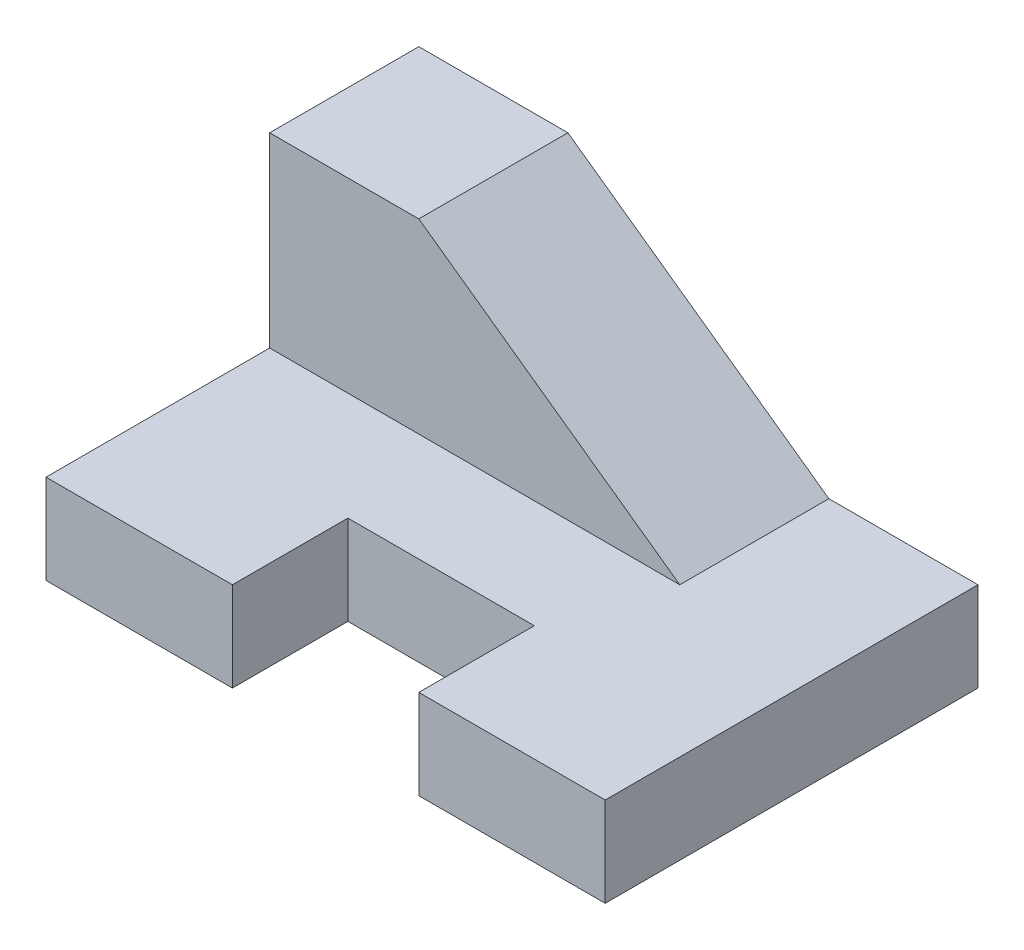
ISO-10303-21;
HEADER;
FILE_DESCRIPTION(('STEP AP214'),'2;1');
FILE_NAME('part.step','',(''),(''),'','','');
FILE_SCHEMA(('AUTOMOTIVE_DESIGN { 1 0 10303 214 1 1 1 1 }'));
ENDSEC;
DATA;
#1=APPLICATION_CONTEXT('core data for automotive mechanical design processes');
#2=APPLICATION_PROTOCOL_DEFINITION('international standard','automotive_design',2000,#1);
#3=PRODUCT_CONTEXT('',#1,'mechanical');
#4=PRODUCT('Part','Part','',(#3));
#5=PRODUCT_RELATED_PRODUCT_CATEGORY('part','',(#4));
#6=PRODUCT_DEFINITION_FORMATION('','',#4);
#7=PRODUCT_DEFINITION_CONTEXT('part definition',#1,'design');
#8=PRODUCT_DEFINITION('design','',#6,#7);
#9=PRODUCT_DEFINITION_SHAPE('','',#8);
#10=(LENGTH_UNIT() NAMED_UNIT(*) SI_UNIT(.MILLI.,.METRE.));
#11=(NAMED_UNIT(*) PLANE_ANGLE_UNIT() SI_UNIT($,.RADIAN.));
#12=(NAMED_UNIT(*) SI_UNIT($,.STERADIAN.) SOLID_ANGLE_UNIT());
#13=UNCERTAINTY_MEASURE_WITH_UNIT(LENGTH_MEASURE(1.E-05),#10,'distance_accuracy_value','');
#14=(GEOMETRIC_REPRESENTATION_CONTEXT(3) GLOBAL_UNCERTAINTY_ASSIGNED_CONTEXT((#13)) GLOBAL_UNIT_ASSIGNED_CONTEXT((#10,
#11,#12)) REPRESENTATION_CONTEXT('',''));
#15=CARTESIAN_POINT('',(0.,0.,0.));
#16=DIRECTION('',(0.,0.,1.));
#17=DIRECTION('',(1.,0.,0.));
#18=AXIS2_PLACEMENT_3D('',#15,#16,#17);
#19=CARTESIAN_POINT('',(0.,12.,0.));
#20=DIRECTION('',(0.,-1.,0.));
#21=DIRECTION('',(0.,0.,-1.));
#22=AXIS2_PLACEMENT_3D('',#19,#20,#21);
#23=PLANE('',#22);
#24=DIRECTION('',(0.,0.,-1.));
#25=VECTOR('',#24,1.);
#26=CARTESIAN_POINT('',(17.5,12.,-5.));
#27=LINE('',#26,#25);
#28=CARTESIAN_POINT('',(17.5,12.,-5.));
#29=VERTEX_POINT('',#28);
#30=CARTESIAN_POINT('',(17.5,12.,-25.));
#31=VERTEX_POINT('',#30);
#32=EDGE_CURVE('E175',#29,#31,#27,.T.);
#33=ORIENTED_EDGE('',*,*,#32,.F.);
#34=DIRECTION('',(-1.,0.,0.));
#35=VECTOR('',#34,1.);
#36=CARTESIAN_POINT('',(17.5,12.,-5.));
#37=LINE('',#36,#35);
#38=CARTESIAN_POINT('',(-37.5,12.,-5.));
#39=VERTEX_POINT('',#38);
#40=EDGE_CURVE('E241',#29,#39,#37,.T.);
#41=ORIENTED_EDGE('',*,*,#40,.T.);
#42=DIRECTION('',(0.,0.,1.));
#43=VECTOR('',#42,1.);
#44=CARTESIAN_POINT('',(-37.5,12.,25.));
#45=LINE('',#44,#43);
#46=CARTESIAN_POINT('',(-37.5,12.,25.));
#47=VERTEX_POINT('',#46);
#48=EDGE_CURVE('E120',#39,#47,#45,.T.);
#49=ORIENTED_EDGE('',*,*,#48,.T.);
#50=DIRECTION('',(1.,0.,0.));
#51=VECTOR('',#50,1.);
#52=CARTESIAN_POINT('',(-12.5,12.,25.));
#53=LINE('',#52,#51);
#54=CARTESIAN_POINT('',(-12.5,12.,25.));
#55=VERTEX_POINT('',#54);
#56=EDGE_CURVE('E222',#47,#55,#53,.T.);
#57=ORIENTED_EDGE('',*,*,#56,.T.);
#58=DIRECTION('',(0.,0.,-1.));
#59=VECTOR('',#58,1.);
#60=CARTESIAN_POINT('',(-12.5,12.,9.51086956521739));
#61=LINE('',#60,#59);
#62=CARTESIAN_POINT('',(-12.5,12.,9.51086956521739));
#63=VERTEX_POINT('',#62);
#64=EDGE_CURVE('E211',#55,#63,#61,.T.);
#65=ORIENTED_EDGE('',*,*,#64,.T.);
#66=DIRECTION('',(1.,0.,0.));
#67=VECTOR('',#66,1.);
#68=CARTESIAN_POINT('',(12.5,12.,9.51086956521739));
#69=LINE('',#68,#67);
#70=CARTESIAN_POINT('',(12.5,12.,9.51086956521739));
#71=VERTEX_POINT('',#70);
#72=EDGE_CURVE('E136',#63,#71,#69,.T.);
#73=ORIENTED_EDGE('',*,*,#72,.T.);
#74=DIRECTION('',(0.,0.,1.));
#75=VECTOR('',#74,1.);
#76=CARTESIAN_POINT('',(12.5,12.,25.));
#77=LINE('',#76,#75);
#78=CARTESIAN_POINT('',(12.5,12.,25.));
#79=VERTEX_POINT('',#78);
#80=EDGE_CURVE('E132',#71,#79,#77,.T.);
#81=ORIENTED_EDGE('',*,*,#80,.T.);
#82=DIRECTION('',(1.,0.,0.));
#83=VECTOR('',#82,1.);
#84=CARTESIAN_POINT('',(37.5,12.,25.));
#85=LINE('',#84,#83);
#86=CARTESIAN_POINT('',(37.5,12.,25.));
#87=VERTEX_POINT('',#86);
#88=EDGE_CURVE('E133',#79,#87,#85,.T.);
#89=ORIENTED_EDGE('',*,*,#88,.T.);
#90=DIRECTION('',(0.,0.,-1.));
#91=VECTOR('',#90,1.);
#92=CARTESIAN_POINT('',(37.5,12.,-25.));
#93=LINE('',#92,#91);
#94=CARTESIAN_POINT('',(37.5,12.,-25.));
#95=VERTEX_POINT('',#94);
#96=EDGE_CURVE('E77',#87,#95,#93,.T.);
#97=ORIENTED_EDGE('',*,*,#96,.T.);
#98=DIRECTION('',(-1.,0.,0.));
#99=VECTOR('',#98,1.);
#100=CARTESIAN_POINT('',(-37.5,12.,-25.));
#101=LINE('',#100,#99);
#102=EDGE_CURVE('E159',#95,#31,#101,.T.);
#103=ORIENTED_EDGE('',*,*,#102,.T.);
#104=EDGE_LOOP('',(#33,#41,#49,#57,#65,#73,#81,#89,#97,#103));
#105=FACE_BOUND('',#104,.T.);
#106=ADVANCED_FACE('F51',(#105),#23,.F.);
#107=CARTESIAN_POINT('',(-37.5,12.,25.));
#108=DIRECTION('',(1.,0.,0.));
#109=DIRECTION('',(0.,0.,-1.));
#110=AXIS2_PLACEMENT_3D('',#107,#108,#109);
#111=PLANE('',#110);
#112=DIRECTION('',(0.,0.,1.));
#113=VECTOR('',#112,1.);
#114=CARTESIAN_POINT('',(-37.5,0.,25.));
#115=LINE('',#114,#113);
#116=CARTESIAN_POINT('',(-37.5,0.,-25.));
#117=VERTEX_POINT('',#116);
#118=CARTESIAN_POINT('',(-37.5,0.,25.));
#119=VERTEX_POINT('',#118);
#120=EDGE_CURVE('E170',#117,#119,#115,.T.);
#121=ORIENTED_EDGE('',*,*,#120,.T.);
#122=DIRECTION('',(0.,-1.,0.));
#123=VECTOR('',#122,1.);
#124=CARTESIAN_POINT('',(-37.5,12.,25.));
#125=LINE('',#124,#123);
#126=EDGE_CURVE('E11',#47,#119,#125,.T.);
#127=ORIENTED_EDGE('',*,*,#126,.F.);
#128=ORIENTED_EDGE('',*,*,#48,.F.);
#129=DIRECTION('',(0.,1.,0.));
#130=VECTOR('',#129,1.);
#131=CARTESIAN_POINT('',(-37.5,12.,-5.));
#132=LINE('',#131,#130);
#133=CARTESIAN_POINT('',(-37.5,37.,-5.));
#134=VERTEX_POINT('',#133);
#135=EDGE_CURVE('E70',#39,#134,#132,.T.);
#136=ORIENTED_EDGE('',*,*,#135,.T.);
#137=DIRECTION('',(0.,0.,-1.));
#138=VECTOR('',#137,1.);
#139=CARTESIAN_POINT('',(-37.5,37.,-5.));
#140=LINE('',#139,#138);
#141=CARTESIAN_POINT('',(-37.5,37.,-25.));
#142=VERTEX_POINT('',#141);
#143=EDGE_CURVE('E229',#134,#142,#140,.T.);
#144=ORIENTED_EDGE('',*,*,#143,.T.);
#145=DIRECTION('',(0.,-1.,0.));
#146=VECTOR('',#145,1.);
#147=CARTESIAN_POINT('',(-37.5,12.,-25.));
#148=LINE('',#147,#146);
#149=EDGE_CURVE('E167',#142,#117,#148,.T.);
#150=ORIENTED_EDGE('',*,*,#149,.T.);
#151=EDGE_LOOP('',(#121,#127,#128,#136,#144,#150));
#152=FACE_BOUND('',#151,.T.);
#153=ADVANCED_FACE('F52',(#152),#111,.F.);
#154=CARTESIAN_POINT('',(-12.5,12.,25.));
#155=DIRECTION('',(0.,0.,-1.));
#156=DIRECTION('',(-1.,0.,0.));
#157=AXIS2_PLACEMENT_3D('',#154,#155,#156);
#158=PLANE('',#157);
#159=DIRECTION('',(1.,0.,0.));
#160=VECTOR('',#159,1.);
#161=CARTESIAN_POINT('',(-12.5,0.,25.));
#162=LINE('',#161,#160);
#163=CARTESIAN_POINT('',(-12.5,0.,25.));
#164=VERTEX_POINT('',#163);
#165=EDGE_CURVE('E172',#119,#164,#162,.T.);
#166=ORIENTED_EDGE('',*,*,#165,.T.);
#167=DIRECTION('',(0.,-1.,0.));
#168=VECTOR('',#167,1.);
#169=CARTESIAN_POINT('',(-12.5,12.,25.));
#170=LINE('',#169,#168);
#171=EDGE_CURVE('E58',#55,#164,#170,.T.);
#172=ORIENTED_EDGE('',*,*,#171,.F.);
#173=ORIENTED_EDGE('',*,*,#56,.F.);
#174=ORIENTED_EDGE('',*,*,#126,.T.);
#175=EDGE_LOOP('',(#166,#172,#173,#174));
#176=FACE_BOUND('',#175,.T.);
#177=ADVANCED_FACE('F263',(#176),#158,.F.);
#178=CARTESIAN_POINT('',(-12.5,12.,9.51086956521739));
#179=DIRECTION('',(-1.,0.,0.));
#180=DIRECTION('',(0.,0.,1.));
#181=AXIS2_PLACEMENT_3D('',#178,#179,#180);
#182=PLANE('',#181);
#183=DIRECTION('',(0.,0.,-1.));
#184=VECTOR('',#183,1.);
#185=CARTESIAN_POINT('',(-12.5,0.,9.51086956521739));
#186=LINE('',#185,#184);
#187=CARTESIAN_POINT('',(-12.5,0.,9.51086956521739));
#188=VERTEX_POINT('',#187);
#189=EDGE_CURVE('E173',#164,#188,#186,.T.);
#190=ORIENTED_EDGE('',*,*,#189,.T.);
#191=DIRECTION('',(0.,-1.,0.));
#192=VECTOR('',#191,1.);
#193=CARTESIAN_POINT('',(-12.5,12.,9.51086956521739));
#194=LINE('',#193,#192);
#195=EDGE_CURVE('E199',#63,#188,#194,.T.);
#196=ORIENTED_EDGE('',*,*,#195,.F.);
#197=ORIENTED_EDGE('',*,*,#64,.F.);
#198=ORIENTED_EDGE('',*,*,#171,.T.);
#199=EDGE_LOOP('',(#190,#196,#197,#198));
#200=FACE_BOUND('',#199,.T.);
#201=ADVANCED_FACE('F207',(#200),#182,.F.);
#202=CARTESIAN_POINT('',(12.5,12.,9.51086956521739));
#203=DIRECTION('',(0.,0.,-1.));
#204=DIRECTION('',(-1.,0.,0.));
#205=AXIS2_PLACEMENT_3D('',#202,#203,#204);
#206=PLANE('',#205);
#207=DIRECTION('',(1.,0.,0.));
#208=VECTOR('',#207,1.);
#209=CARTESIAN_POINT('',(12.5,0.,9.51086956521739));
#210=LINE('',#209,#208);
#211=CARTESIAN_POINT('',(12.5,0.,9.51086956521739));
#212=VERTEX_POINT('',#211);
#213=EDGE_CURVE('E176',#188,#212,#210,.T.);
#214=ORIENTED_EDGE('',*,*,#213,.T.);
#215=DIRECTION('',(0.,-1.,0.));
#216=VECTOR('',#215,1.);
#217=CARTESIAN_POINT('',(12.5,12.,9.51086956521739));
#218=LINE('',#217,#216);
#219=EDGE_CURVE('E155',#71,#212,#218,.T.);
#220=ORIENTED_EDGE('',*,*,#219,.F.);
#221=ORIENTED_EDGE('',*,*,#72,.F.);
#222=ORIENTED_EDGE('',*,*,#195,.T.);
#223=EDGE_LOOP('',(#214,#220,#221,#222));
#224=FACE_BOUND('',#223,.T.);
#225=ADVANCED_FACE('F217',(#224),#206,.F.);
#226=CARTESIAN_POINT('',(12.5,12.,25.));
#227=DIRECTION('',(1.,0.,0.));
#228=DIRECTION('',(0.,0.,-1.));
#229=AXIS2_PLACEMENT_3D('',#226,#227,#228);
#230=PLANE('',#229);
#231=DIRECTION('',(0.,0.,1.));
#232=VECTOR('',#231,1.);
#233=CARTESIAN_POINT('',(12.5,0.,25.));
#234=LINE('',#233,#232);
#235=CARTESIAN_POINT('',(12.5,0.,25.));
#236=VERTEX_POINT('',#235);
#237=EDGE_CURVE('E146',#212,#236,#234,.T.);
#238=ORIENTED_EDGE('',*,*,#237,.T.);
#239=DIRECTION('',(0.,-1.,0.));
#240=VECTOR('',#239,1.);
#241=CARTESIAN_POINT('',(12.5,12.,25.));
#242=LINE('',#241,#240);
#243=EDGE_CURVE('E144',#79,#236,#242,.T.);
#244=ORIENTED_EDGE('',*,*,#243,.F.);
#245=ORIENTED_EDGE('',*,*,#80,.F.);
#246=ORIENTED_EDGE('',*,*,#219,.T.);
#247=EDGE_LOOP('',(#238,#244,#245,#246));
#248=FACE_BOUND('',#247,.T.);
#249=ADVANCED_FACE('F148',(#248),#230,.F.);
#250=CARTESIAN_POINT('',(37.5,12.,25.));
#251=DIRECTION('',(0.,0.,-1.));
#252=DIRECTION('',(-1.,0.,0.));
#253=AXIS2_PLACEMENT_3D('',#250,#251,#252);
#254=PLANE('',#253);
#255=DIRECTION('',(1.,0.,0.));
#256=VECTOR('',#255,1.);
#257=CARTESIAN_POINT('',(37.5,0.,25.));
#258=LINE('',#257,#256);
#259=CARTESIAN_POINT('',(37.5,0.,25.));
#260=VERTEX_POINT('',#259);
#261=EDGE_CURVE('E181',#236,#260,#258,.T.);
#262=ORIENTED_EDGE('',*,*,#261,.T.);
#263=DIRECTION('',(0.,-1.,0.));
#264=VECTOR('',#263,1.);
#265=CARTESIAN_POINT('',(37.5,12.,25.));
#266=LINE('',#265,#264);
#267=EDGE_CURVE('E153',#87,#260,#266,.T.);
#268=ORIENTED_EDGE('',*,*,#267,.F.);
#269=ORIENTED_EDGE('',*,*,#88,.F.);
#270=ORIENTED_EDGE('',*,*,#243,.T.);
#271=EDGE_LOOP('',(#262,#268,#269,#270));
#272=FACE_BOUND('',#271,.T.);
#273=ADVANCED_FACE('F154',(#272),#254,.F.);
#274=CARTESIAN_POINT('',(37.5,12.,-25.));
#275=DIRECTION('',(-1.,0.,0.));
#276=DIRECTION('',(0.,0.,1.));
#277=AXIS2_PLACEMENT_3D('',#274,#275,#276);
#278=PLANE('',#277);
#279=DIRECTION('',(0.,0.,-1.));
#280=VECTOR('',#279,1.);
#281=CARTESIAN_POINT('',(37.5,0.,-25.));
#282=LINE('',#281,#280);
#283=CARTESIAN_POINT('',(37.5,0.,-25.));
#284=VERTEX_POINT('',#283);
#285=EDGE_CURVE('E187',#260,#284,#282,.T.);
#286=ORIENTED_EDGE('',*,*,#285,.T.);
#287=DIRECTION('',(0.,-1.,0.));
#288=VECTOR('',#287,1.);
#289=CARTESIAN_POINT('',(37.5,12.,-25.));
#290=LINE('',#289,#288);
#291=EDGE_CURVE('E191',#95,#284,#290,.T.);
#292=ORIENTED_EDGE('',*,*,#291,.F.);
#293=ORIENTED_EDGE('',*,*,#96,.F.);
#294=ORIENTED_EDGE('',*,*,#267,.T.);
#295=EDGE_LOOP('',(#286,#292,#293,#294));
#296=FACE_BOUND('',#295,.T.);
#297=ADVANCED_FACE('F281',(#296),#278,.F.);
#298=CARTESIAN_POINT('',(-37.5,12.,-25.));
#299=DIRECTION('',(0.,0.,1.));
#300=DIRECTION('',(1.,0.,0.));
#301=AXIS2_PLACEMENT_3D('',#298,#299,#300);
#302=PLANE('',#301);
#303=DIRECTION('',(-1.,0.,0.));
#304=VECTOR('',#303,1.);
#305=CARTESIAN_POINT('',(-37.5,0.,-25.));
#306=LINE('',#305,#304);
#307=EDGE_CURVE('E109',#284,#117,#306,.T.);
#308=ORIENTED_EDGE('',*,*,#307,.T.);
#309=ORIENTED_EDGE('',*,*,#149,.F.);
#310=DIRECTION('',(1.,0.,0.));
#311=VECTOR('',#310,1.);
#312=CARTESIAN_POINT('',(-37.5,37.,-25.));
#313=LINE('',#312,#311);
#314=CARTESIAN_POINT('',(-17.5,37.,-25.));
#315=VERTEX_POINT('',#314);
#316=EDGE_CURVE('E243',#142,#315,#313,.T.);
#317=ORIENTED_EDGE('',*,*,#316,.T.);
#318=DIRECTION('',(0.813733471206735,-0.581238193719096,0.));
#319=VECTOR('',#318,1.);
#320=CARTESIAN_POINT('',(-17.5,37.,-25.));
#321=LINE('',#320,#319);
#322=EDGE_CURVE('E238',#315,#31,#321,.T.);
#323=ORIENTED_EDGE('',*,*,#322,.T.);
#324=ORIENTED_EDGE('',*,*,#102,.F.);
#325=ORIENTED_EDGE('',*,*,#291,.T.);
#326=EDGE_LOOP('',(#308,#309,#317,#323,#324,#325));
#327=FACE_BOUND('',#326,.T.);
#328=ADVANCED_FACE('F282',(#327),#302,.F.);
#329=CARTESIAN_POINT('',(0.,0.,0.));
#330=DIRECTION('',(0.,-1.,0.));
#331=DIRECTION('',(0.,0.,-1.));
#332=AXIS2_PLACEMENT_3D('',#329,#330,#331);
#333=PLANE('',#332);
#334=ORIENTED_EDGE('',*,*,#120,.F.);
#335=ORIENTED_EDGE('',*,*,#307,.F.);
#336=ORIENTED_EDGE('',*,*,#285,.F.);
#337=ORIENTED_EDGE('',*,*,#261,.F.);
#338=ORIENTED_EDGE('',*,*,#237,.F.);
#339=ORIENTED_EDGE('',*,*,#213,.F.);
#340=ORIENTED_EDGE('',*,*,#189,.F.);
#341=ORIENTED_EDGE('',*,*,#165,.F.);
#342=EDGE_LOOP('',(#334,#335,#336,#337,#338,#339,#340,#341));
#343=FACE_BOUND('',#342,.T.);
#344=ADVANCED_FACE('F216',(#343),#333,.T.);
#345=CARTESIAN_POINT('',(-17.5,37.,-5.));
#346=DIRECTION('',(0.581238193719096,0.813733471206735,0.));
#347=DIRECTION('',(-0.813733471206735,0.581238193719096,0.));
#348=AXIS2_PLACEMENT_3D('',#345,#346,#347);
#349=PLANE('',#348);
#350=ORIENTED_EDGE('',*,*,#322,.F.);
#351=DIRECTION('',(0.,0.,-1.));
#352=VECTOR('',#351,1.);
#353=CARTESIAN_POINT('',(-17.5,37.,-5.));
#354=LINE('',#353,#352);
#355=CARTESIAN_POINT('',(-17.5,37.,-5.));
#356=VERTEX_POINT('',#355);
#357=EDGE_CURVE('E235',#356,#315,#354,.T.);
#358=ORIENTED_EDGE('',*,*,#357,.F.);
#359=DIRECTION('',(0.813733471206735,-0.581238193719096,0.));
#360=VECTOR('',#359,1.);
#361=CARTESIAN_POINT('',(-17.5,37.,-5.));
#362=LINE('',#361,#360);
#363=EDGE_CURVE('E231',#356,#29,#362,.T.);
#364=ORIENTED_EDGE('',*,*,#363,.T.);
#365=ORIENTED_EDGE('',*,*,#32,.T.);
#366=EDGE_LOOP('',(#350,#358,#364,#365));
#367=FACE_BOUND('',#366,.T.);
#368=ADVANCED_FACE('F278',(#367),#349,.T.);
#369=CARTESIAN_POINT('',(-37.5,37.,-5.));
#370=DIRECTION('',(0.,1.,0.));
#371=DIRECTION('',(0.,0.,1.));
#372=AXIS2_PLACEMENT_3D('',#369,#370,#371);
#373=PLANE('',#372);
#374=ORIENTED_EDGE('',*,*,#316,.F.);
#375=ORIENTED_EDGE('',*,*,#143,.F.);
#376=DIRECTION('',(1.,0.,0.));
#377=VECTOR('',#376,1.);
#378=CARTESIAN_POINT('',(-37.5,37.,-5.));
#379=LINE('',#378,#377);
#380=EDGE_CURVE('E252',#134,#356,#379,.T.);
#381=ORIENTED_EDGE('',*,*,#380,.T.);
#382=ORIENTED_EDGE('',*,*,#357,.T.);
#383=EDGE_LOOP('',(#374,#375,#381,#382));
#384=FACE_BOUND('',#383,.T.);
#385=ADVANCED_FACE('F280',(#384),#373,.T.);
#386=CARTESIAN_POINT('',(0.,0.,-5.));
#387=DIRECTION('',(0.,0.,-1.));
#388=DIRECTION('',(-1.,0.,0.));
#389=AXIS2_PLACEMENT_3D('',#386,#387,#388);
#390=PLANE('',#389);
#391=ORIENTED_EDGE('',*,*,#40,.F.);
#392=ORIENTED_EDGE('',*,*,#363,.F.);
#393=ORIENTED_EDGE('',*,*,#380,.F.);
#394=ORIENTED_EDGE('',*,*,#135,.F.);
#395=EDGE_LOOP('',(#391,#392,#393,#394));
#396=FACE_BOUND('',#395,.T.);
#397=ADVANCED_FACE('F353',(#396),#390,.F.);
#398=CLOSED_SHELL('',(#106,#153,#177,#201,#225,#249,#273,#297,#328,#344,#368,#385,#397));
#399=MANIFOLD_SOLID_BREP('B2',#398);
#400=ADVANCED_BREP_SHAPE_REPRESENTATION('',(#18,#399),#14);
#401=SHAPE_DEFINITION_REPRESENTATION(#9,#400);
ENDSEC;
END-ISO-10303-21;
